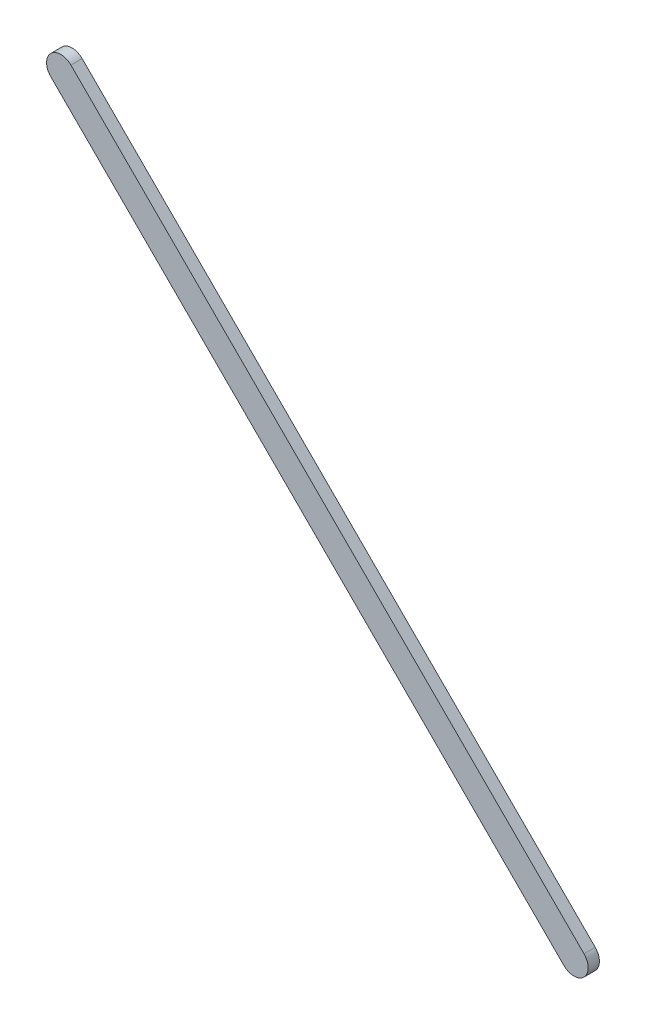
ISO-10303-21;
HEADER;
FILE_DESCRIPTION(('STEP AP214'),'2;1');
FILE_NAME('part.step','',(''),(''),'','','');
FILE_SCHEMA(('AUTOMOTIVE_DESIGN { 1 0 10303 214 1 1 1 1 }'));
ENDSEC;
DATA;
#1=APPLICATION_CONTEXT('core data for automotive mechanical design processes');
#2=APPLICATION_PROTOCOL_DEFINITION('international standard','automotive_design',2000,#1);
#3=PRODUCT_CONTEXT('',#1,'mechanical');
#4=PRODUCT('Part','Part','',(#3));
#5=PRODUCT_RELATED_PRODUCT_CATEGORY('part','',(#4));
#6=PRODUCT_DEFINITION_FORMATION('','',#4);
#7=PRODUCT_DEFINITION_CONTEXT('part definition',#1,'design');
#8=PRODUCT_DEFINITION('design','',#6,#7);
#9=PRODUCT_DEFINITION_SHAPE('','',#8);
#10=(LENGTH_UNIT() NAMED_UNIT(*) SI_UNIT(.MILLI.,.METRE.));
#11=(NAMED_UNIT(*) PLANE_ANGLE_UNIT() SI_UNIT($,.RADIAN.));
#12=(NAMED_UNIT(*) SI_UNIT($,.STERADIAN.) SOLID_ANGLE_UNIT());
#13=UNCERTAINTY_MEASURE_WITH_UNIT(LENGTH_MEASURE(1.E-05),#10,'distance_accuracy_value','');
#14=(GEOMETRIC_REPRESENTATION_CONTEXT(3) GLOBAL_UNCERTAINTY_ASSIGNED_CONTEXT((#13)) GLOBAL_UNIT_ASSIGNED_CONTEXT((#10,
#11,#12)) REPRESENTATION_CONTEXT('',''));
#15=CARTESIAN_POINT('',(0.,0.,0.));
#16=DIRECTION('',(0.,0.,1.));
#17=DIRECTION('',(1.,0.,0.));
#18=AXIS2_PLACEMENT_3D('',#15,#16,#17);
#19=CARTESIAN_POINT('',(99.2359966,107.64339406,0.));
#20=DIRECTION('',(0.707106781186548,0.707106781186547,0.));
#21=DIRECTION('',(0.707106781186547,-0.707106781186548,0.));
#22=AXIS2_PLACEMENT_3D('',#19,#20,#21);
#23=PLANE('',#22);
#24=DIRECTION('',(0.707106781186547,-0.707106781186548,0.));
#25=VECTOR('',#24,1.);
#26=CARTESIAN_POINT('',(99.2359966,107.64339406,0.1999996));
#27=LINE('',#26,#25);
#28=CARTESIAN_POINT('',(99.2359966,107.64339406,0.1999996));
#29=VERTEX_POINT('',#28);
#30=CARTESIAN_POINT('',(108.37999406,98.4993966,0.1999996));
#31=VERTEX_POINT('',#30);
#32=EDGE_CURVE('E11',#29,#31,#27,.T.);
#33=ORIENTED_EDGE('',*,*,#32,.F.);
#34=DIRECTION('',(0.,0.,1.));
#35=VECTOR('',#34,1.);
#36=CARTESIAN_POINT('',(99.2359966,107.64339406,0.));
#37=LINE('',#36,#35);
#38=CARTESIAN_POINT('',(99.2359966,107.64339406,0.));
#39=VERTEX_POINT('',#38);
#40=EDGE_CURVE('E24',#39,#29,#37,.T.);
#41=ORIENTED_EDGE('',*,*,#40,.F.);
#42=DIRECTION('',(0.707106781186547,-0.707106781186548,0.));
#43=VECTOR('',#42,1.);
#44=CARTESIAN_POINT('',(99.2359966,107.64339406,0.));
#45=LINE('',#44,#43);
#46=CARTESIAN_POINT('',(108.37999406,98.4993966,0.));
#47=VERTEX_POINT('',#46);
#48=EDGE_CURVE('E75',#39,#47,#45,.T.);
#49=ORIENTED_EDGE('',*,*,#48,.T.);
#50=DIRECTION('',(0.,0.,1.));
#51=VECTOR('',#50,1.);
#52=CARTESIAN_POINT('',(108.37999406,98.4993966,0.));
#53=LINE('',#52,#51);
#54=EDGE_CURVE('E37',#47,#31,#53,.T.);
#55=ORIENTED_EDGE('',*,*,#54,.T.);
#56=EDGE_LOOP('',(#33,#41,#49,#55));
#57=FACE_BOUND('',#56,.T.);
#58=ADVANCED_FACE('F17',(#57),#23,.F.);
#59=CARTESIAN_POINT('',(108.55959873,98.67900127,0.));
#60=DIRECTION('',(0.,0.,-1.));
#61=DIRECTION('',(-0.707106781186576,-0.70710678118652,0.));
#62=AXIS2_PLACEMENT_3D('',#59,#60,#61);
#63=CYLINDRICAL_SURFACE('',#62,0.253999360179542);
#64=CARTESIAN_POINT('',(108.55959873,98.67900127,0.1999996));
#65=DIRECTION('',(0.,0.,1.));
#66=DIRECTION('',(-0.707106781186576,-0.70710678118652,0.));
#67=AXIS2_PLACEMENT_3D('',#64,#65,#66);
#68=CIRCLE('',#67,0.253999360179542);
#69=CARTESIAN_POINT('',(108.7392034,98.85860594,0.1999996));
#70=VERTEX_POINT('',#69);
#71=EDGE_CURVE('E83',#31,#70,#68,.T.);
#72=ORIENTED_EDGE('',*,*,#71,.F.);
#73=ORIENTED_EDGE('',*,*,#54,.F.);
#74=CARTESIAN_POINT('',(108.55959873,98.67900127,0.));
#75=DIRECTION('',(0.,0.,1.));
#76=DIRECTION('',(-0.707106781186576,-0.70710678118652,0.));
#77=AXIS2_PLACEMENT_3D('',#74,#75,#76);
#78=CIRCLE('',#77,0.253999360179542);
#79=CARTESIAN_POINT('',(108.7392034,98.85860594,0.));
#80=VERTEX_POINT('',#79);
#81=EDGE_CURVE('E81',#47,#80,#78,.T.);
#82=ORIENTED_EDGE('',*,*,#81,.T.);
#83=DIRECTION('',(0.,0.,1.));
#84=VECTOR('',#83,1.);
#85=CARTESIAN_POINT('',(108.7392034,98.85860594,0.));
#86=LINE('',#85,#84);
#87=EDGE_CURVE('E67',#80,#70,#86,.T.);
#88=ORIENTED_EDGE('',*,*,#87,.T.);
#89=EDGE_LOOP('',(#72,#73,#82,#88));
#90=FACE_BOUND('',#89,.T.);
#91=ADVANCED_FACE('F89',(#90),#63,.T.);
#92=CARTESIAN_POINT('',(108.7392034,98.85860594,0.));
#93=DIRECTION('',(-0.707106781186548,-0.707106781186548,0.));
#94=DIRECTION('',(-0.707106781186548,0.707106781186548,0.));
#95=AXIS2_PLACEMENT_3D('',#92,#93,#94);
#96=PLANE('',#95);
#97=DIRECTION('',(-0.707106781186548,0.707106781186548,0.));
#98=VECTOR('',#97,1.);
#99=CARTESIAN_POINT('',(108.7392034,98.85860594,0.1999996));
#100=LINE('',#99,#98);
#101=CARTESIAN_POINT('',(99.59520594,108.0026034,0.1999996));
#102=VERTEX_POINT('',#101);
#103=EDGE_CURVE('E71',#70,#102,#100,.T.);
#104=ORIENTED_EDGE('',*,*,#103,.F.);
#105=ORIENTED_EDGE('',*,*,#87,.F.);
#106=DIRECTION('',(-0.707106781186548,0.707106781186548,0.));
#107=VECTOR('',#106,1.);
#108=CARTESIAN_POINT('',(108.7392034,98.85860594,0.));
#109=LINE('',#108,#107);
#110=CARTESIAN_POINT('',(99.59520594,108.0026034,0.));
#111=VERTEX_POINT('',#110);
#112=EDGE_CURVE('E63',#80,#111,#109,.T.);
#113=ORIENTED_EDGE('',*,*,#112,.T.);
#114=DIRECTION('',(0.,0.,1.));
#115=VECTOR('',#114,1.);
#116=CARTESIAN_POINT('',(99.59520594,108.0026034,0.));
#117=LINE('',#116,#115);
#118=EDGE_CURVE('E53',#111,#102,#117,.T.);
#119=ORIENTED_EDGE('',*,*,#118,.T.);
#120=EDGE_LOOP('',(#104,#105,#113,#119));
#121=FACE_BOUND('',#120,.T.);
#122=ADVANCED_FACE('F66',(#121),#96,.F.);
#123=CARTESIAN_POINT('',(99.41560127,107.82299873,0.));
#124=DIRECTION('',(0.,0.,-1.));
#125=DIRECTION('',(0.70710678118652,0.707106781186576,0.));
#126=AXIS2_PLACEMENT_3D('',#123,#124,#125);
#127=CYLINDRICAL_SURFACE('',#126,0.253999360179539);
#128=CARTESIAN_POINT('',(99.41560127,107.82299873,0.1999996));
#129=DIRECTION('',(0.,0.,1.));
#130=DIRECTION('',(0.70710678118652,0.707106781186576,0.));
#131=AXIS2_PLACEMENT_3D('',#128,#129,#130);
#132=CIRCLE('',#131,0.253999360179539);
#133=EDGE_CURVE('E59',#102,#29,#132,.T.);
#134=ORIENTED_EDGE('',*,*,#133,.F.);
#135=ORIENTED_EDGE('',*,*,#118,.F.);
#136=CARTESIAN_POINT('',(99.41560127,107.82299873,0.));
#137=DIRECTION('',(0.,0.,1.));
#138=DIRECTION('',(0.70710678118652,0.707106781186576,0.));
#139=AXIS2_PLACEMENT_3D('',#136,#137,#138);
#140=CIRCLE('',#139,0.253999360179539);
#141=EDGE_CURVE('E57',#111,#39,#140,.T.);
#142=ORIENTED_EDGE('',*,*,#141,.T.);
#143=ORIENTED_EDGE('',*,*,#40,.T.);
#144=EDGE_LOOP('',(#134,#135,#142,#143));
#145=FACE_BOUND('',#144,.T.);
#146=ADVANCED_FACE('F55',(#145),#127,.T.);
#147=CARTESIAN_POINT('',(99.2359966,107.64339406,0.));
#148=DIRECTION('',(0.,0.,-1.));
#149=DIRECTION('',(-1.,0.,0.));
#150=AXIS2_PLACEMENT_3D('',#147,#148,#149);
#151=PLANE('',#150);
#152=ORIENTED_EDGE('',*,*,#141,.F.);
#153=ORIENTED_EDGE('',*,*,#112,.F.);
#154=ORIENTED_EDGE('',*,*,#81,.F.);
#155=ORIENTED_EDGE('',*,*,#48,.F.);
#156=EDGE_LOOP('',(#152,#153,#154,#155));
#157=FACE_BOUND('',#156,.T.);
#158=ADVANCED_FACE('F74',(#157),#151,.T.);
#159=CARTESIAN_POINT('',(99.2359966,107.64339406,0.1999996));
#160=DIRECTION('',(0.,0.,-1.));
#161=DIRECTION('',(-1.,0.,0.));
#162=AXIS2_PLACEMENT_3D('',#159,#160,#161);
#163=PLANE('',#162);
#164=ORIENTED_EDGE('',*,*,#32,.T.);
#165=ORIENTED_EDGE('',*,*,#71,.T.);
#166=ORIENTED_EDGE('',*,*,#103,.T.);
#167=ORIENTED_EDGE('',*,*,#133,.T.);
#168=EDGE_LOOP('',(#164,#165,#166,#167));
#169=FACE_BOUND('',#168,.T.);
#170=ADVANCED_FACE('F91',(#169),#163,.F.);
#171=CLOSED_SHELL('',(#58,#91,#122,#146,#158,#170));
#172=MANIFOLD_SOLID_BREP('B1',#171);
#173=ADVANCED_BREP_SHAPE_REPRESENTATION('',(#18,#172),#14);
#174=SHAPE_DEFINITION_REPRESENTATION(#9,#173);
ENDSEC;
END-ISO-10303-21;
